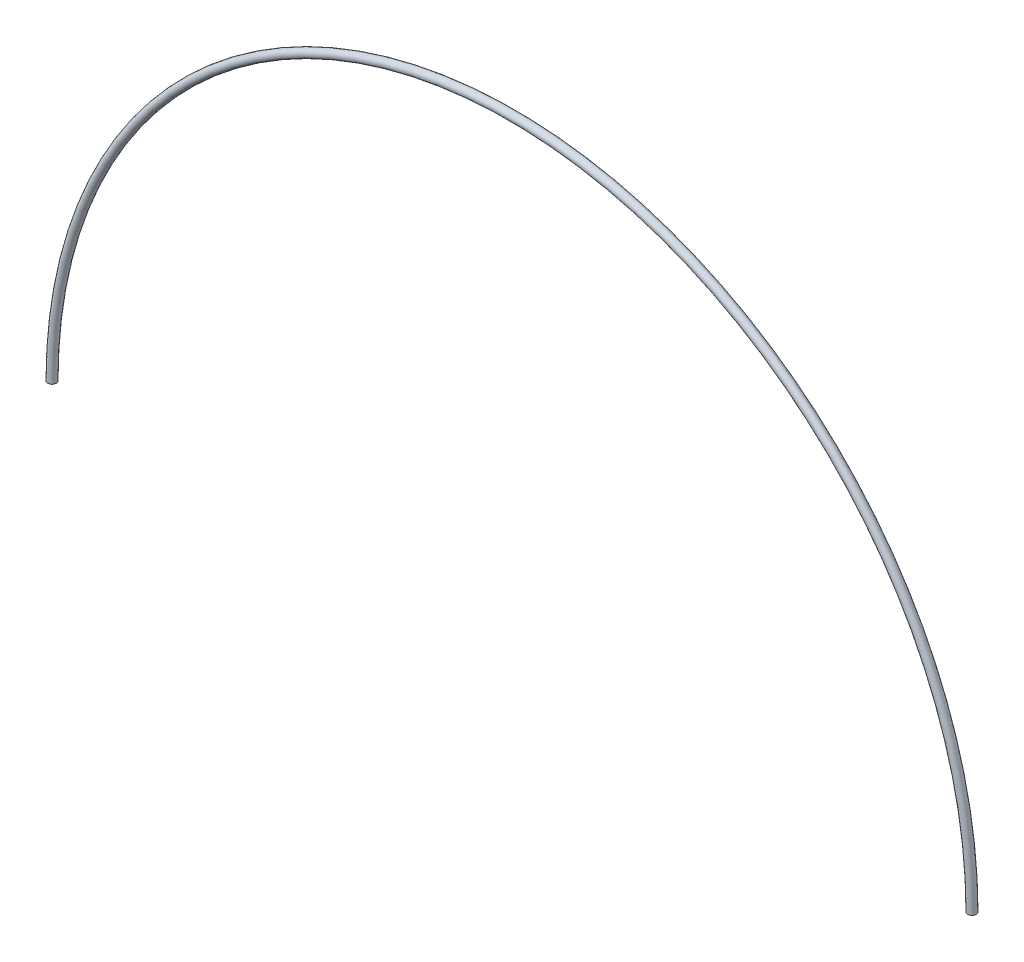
ISO-10303-21;
HEADER;
FILE_DESCRIPTION(('STEP AP214'),'2;1');
FILE_NAME('part.step','',(''),(''),'','','');
FILE_SCHEMA(('AUTOMOTIVE_DESIGN { 1 0 10303 214 1 1 1 1 }'));
ENDSEC;
DATA;
#1=APPLICATION_CONTEXT('core data for automotive mechanical design processes');
#2=APPLICATION_PROTOCOL_DEFINITION('international standard','automotive_design',2000,#1);
#3=PRODUCT_CONTEXT('',#1,'mechanical');
#4=PRODUCT('Part','Part','',(#3));
#5=PRODUCT_RELATED_PRODUCT_CATEGORY('part','',(#4));
#6=PRODUCT_DEFINITION_FORMATION('','',#4);
#7=PRODUCT_DEFINITION_CONTEXT('part definition',#1,'design');
#8=PRODUCT_DEFINITION('design','',#6,#7);
#9=PRODUCT_DEFINITION_SHAPE('','',#8);
#10=(LENGTH_UNIT() NAMED_UNIT(*) SI_UNIT(.MILLI.,.METRE.));
#11=(NAMED_UNIT(*) PLANE_ANGLE_UNIT() SI_UNIT($,.RADIAN.));
#12=(NAMED_UNIT(*) SI_UNIT($,.STERADIAN.) SOLID_ANGLE_UNIT());
#13=UNCERTAINTY_MEASURE_WITH_UNIT(LENGTH_MEASURE(1.E-05),#10,'distance_accuracy_value','');
#14=(GEOMETRIC_REPRESENTATION_CONTEXT(3) GLOBAL_UNCERTAINTY_ASSIGNED_CONTEXT((#13)) GLOBAL_UNIT_ASSIGNED_CONTEXT((#10,
#11,#12)) REPRESENTATION_CONTEXT('',''));
#15=CARTESIAN_POINT('',(0.,0.,0.));
#16=DIRECTION('',(0.,0.,1.));
#17=DIRECTION('',(1.,0.,0.));
#18=AXIS2_PLACEMENT_3D('',#15,#16,#17);
#19=CARTESIAN_POINT('',(1600.2,0.,0.));
#20=DIRECTION('',(0.,0.,1.));
#21=DIRECTION('',(1.,0.,0.));
#22=AXIS2_PLACEMENT_3D('',#19,#20,#21);
#23=TOROIDAL_SURFACE('',#22,1600.2,13.3223);
#24=CARTESIAN_POINT('',(3200.4,1.95967980799559E-13,0.));
#25=DIRECTION('',(0.,-1.,0.));
#26=DIRECTION('',(0.,0.,1.));
#27=AXIS2_PLACEMENT_3D('',#24,#25,#26);
#28=CIRCLE('',#27,13.3223);
#29=CARTESIAN_POINT('',(3213.7223,1.97599492004788E-13,0.));
#30=VERTEX_POINT('',#29);
#31=EDGE_CURVE('E37',#30,#30,#28,.T.);
#32=CARTESIAN_POINT('',(0.,0.,0.));
#33=DIRECTION('',(0.,1.,0.));
#34=DIRECTION('',(0.,0.,1.));
#35=AXIS2_PLACEMENT_3D('',#32,#33,#34);
#36=CIRCLE('',#35,13.3223);
#37=CARTESIAN_POINT('',(-13.3223,0.,0.));
#38=VERTEX_POINT('',#37);
#39=EDGE_CURVE('E45',#38,#38,#36,.T.);
#40=CARTESIAN_POINT('',(1600.2,0.,0.));
#41=DIRECTION('',(0.,0.,1.));
#42=DIRECTION('',(1.,0.,0.));
#43=AXIS2_PLACEMENT_3D('',#40,#41,#42);
#44=CIRCLE('',#43,1613.5223);
#45=EDGE_CURVE('',#30,#38,#44,.T.);
#46=ORIENTED_EDGE('',*,*,#31,.T.);
#47=ORIENTED_EDGE('',*,*,#39,.F.);
#48=ORIENTED_EDGE('',*,*,#45,.T.);
#49=ORIENTED_EDGE('',*,*,#45,.F.);
#50=EDGE_LOOP('',(#46,#48,#47,#49));
#51=FACE_BOUND('',#50,.T.);
#52=ADVANCED_FACE('F30',(#51),#23,.F.);
#53=CARTESIAN_POINT('',(1600.2,0.,0.));
#54=DIRECTION('',(0.,0.,1.));
#55=DIRECTION('',(1.,0.,0.));
#56=AXIS2_PLACEMENT_3D('',#53,#54,#55);
#57=TOROIDAL_SURFACE('',#56,1600.2,14.7701);
#58=CARTESIAN_POINT('',(3200.4,1.95967980799559E-13,0.));
#59=DIRECTION('',(0.,-1.,0.));
#60=DIRECTION('',(0.,0.,1.));
#61=AXIS2_PLACEMENT_3D('',#58,#59,#60);
#62=CIRCLE('',#61,14.7701);
#63=CARTESIAN_POINT('',(3215.1701,1.97776796368368E-13,0.));
#64=VERTEX_POINT('',#63);
#65=EDGE_CURVE('E10',#64,#64,#62,.T.);
#66=CARTESIAN_POINT('',(0.,0.,0.));
#67=DIRECTION('',(0.,1.,0.));
#68=DIRECTION('',(0.,0.,1.));
#69=AXIS2_PLACEMENT_3D('',#66,#67,#68);
#70=CIRCLE('',#69,14.7701);
#71=CARTESIAN_POINT('',(-14.7701,0.,0.));
#72=VERTEX_POINT('',#71);
#73=EDGE_CURVE('E41',#72,#72,#70,.T.);
#74=CARTESIAN_POINT('',(1600.2,0.,0.));
#75=DIRECTION('',(0.,0.,1.));
#76=DIRECTION('',(1.,0.,0.));
#77=AXIS2_PLACEMENT_3D('',#74,#75,#76);
#78=CIRCLE('',#77,1614.9701);
#79=EDGE_CURVE('',#64,#72,#78,.T.);
#80=ORIENTED_EDGE('',*,*,#65,.F.);
#81=ORIENTED_EDGE('',*,*,#73,.T.);
#82=ORIENTED_EDGE('',*,*,#79,.T.);
#83=ORIENTED_EDGE('',*,*,#79,.F.);
#84=EDGE_LOOP('',(#80,#82,#81,#83));
#85=FACE_BOUND('',#84,.T.);
#86=ADVANCED_FACE('F32',(#85),#57,.T.);
#87=CARTESIAN_POINT('',(3200.4,1.95967980799559E-13,0.));
#88=DIRECTION('',(0.,-1.,0.));
#89=DIRECTION('',(0.,0.,1.));
#90=AXIS2_PLACEMENT_3D('',#87,#88,#89);
#91=PLANE('',#90);
#92=ORIENTED_EDGE('',*,*,#31,.F.);
#93=EDGE_LOOP('',(#92));
#94=FACE_BOUND('',#93,.T.);
#95=ORIENTED_EDGE('',*,*,#65,.T.);
#96=EDGE_LOOP('',(#95));
#97=FACE_BOUND('',#96,.T.);
#98=ADVANCED_FACE('F58',(#94,#97),#91,.T.);
#99=CARTESIAN_POINT('',(0.,0.,0.));
#100=DIRECTION('',(0.,1.,0.));
#101=DIRECTION('',(0.,0.,1.));
#102=AXIS2_PLACEMENT_3D('',#99,#100,#101);
#103=PLANE('',#102);
#104=ORIENTED_EDGE('',*,*,#39,.T.);
#105=EDGE_LOOP('',(#104));
#106=FACE_BOUND('',#105,.T.);
#107=ORIENTED_EDGE('',*,*,#73,.F.);
#108=EDGE_LOOP('',(#107));
#109=FACE_BOUND('',#108,.T.);
#110=ADVANCED_FACE('F51',(#106,#109),#103,.F.);
#111=CLOSED_SHELL('',(#52,#86,#98,#110));
#112=MANIFOLD_SOLID_BREP('B2',#111);
#113=ADVANCED_BREP_SHAPE_REPRESENTATION('',(#18,#112),#14);
#114=SHAPE_DEFINITION_REPRESENTATION(#9,#113);
ENDSEC;
END-ISO-10303-21;
